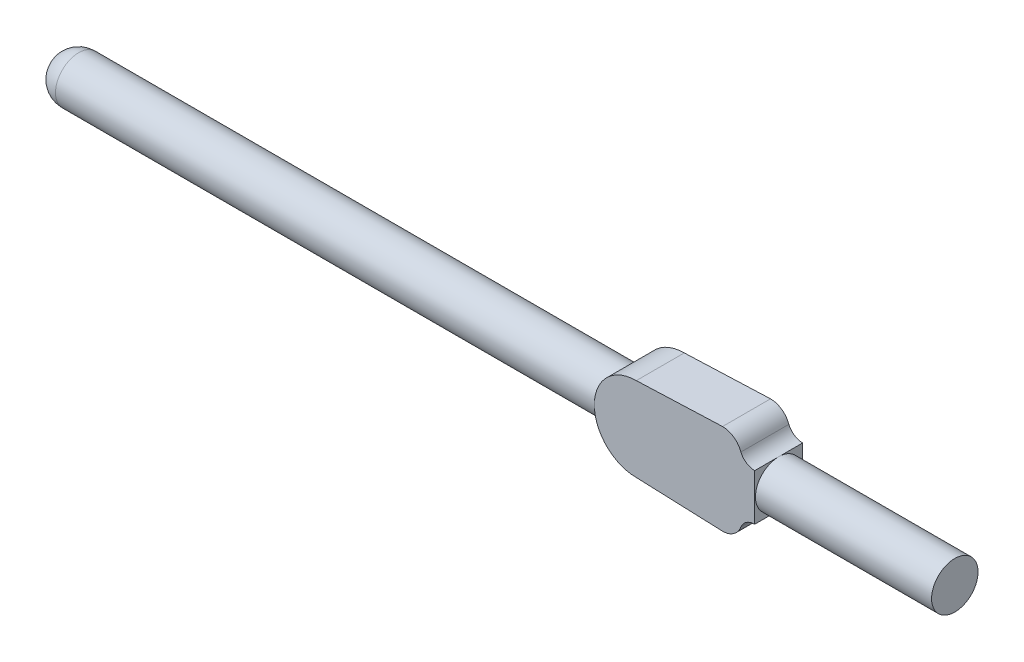
ISO-10303-21;
HEADER;
FILE_DESCRIPTION(('STEP AP214'),'2;1');
FILE_NAME('part.step','',(''),(''),'','','');
FILE_SCHEMA(('AUTOMOTIVE_DESIGN { 1 0 10303 214 1 1 1 1 }'));
ENDSEC;
DATA;
#1=APPLICATION_CONTEXT('core data for automotive mechanical design processes');
#2=APPLICATION_PROTOCOL_DEFINITION('international standard','automotive_design',2000,#1);
#3=PRODUCT_CONTEXT('',#1,'mechanical');
#4=PRODUCT('Part','Part','',(#3));
#5=PRODUCT_RELATED_PRODUCT_CATEGORY('part','',(#4));
#6=PRODUCT_DEFINITION_FORMATION('','',#4);
#7=PRODUCT_DEFINITION_CONTEXT('part definition',#1,'design');
#8=PRODUCT_DEFINITION('design','',#6,#7);
#9=PRODUCT_DEFINITION_SHAPE('','',#8);
#10=(LENGTH_UNIT() NAMED_UNIT(*) SI_UNIT(.MILLI.,.METRE.));
#11=(NAMED_UNIT(*) PLANE_ANGLE_UNIT() SI_UNIT($,.RADIAN.));
#12=(NAMED_UNIT(*) SI_UNIT($,.STERADIAN.) SOLID_ANGLE_UNIT());
#13=UNCERTAINTY_MEASURE_WITH_UNIT(LENGTH_MEASURE(1.E-05),#10,'distance_accuracy_value','');
#14=(GEOMETRIC_REPRESENTATION_CONTEXT(3) GLOBAL_UNCERTAINTY_ASSIGNED_CONTEXT((#13)) GLOBAL_UNIT_ASSIGNED_CONTEXT((#10,
#11,#12)) REPRESENTATION_CONTEXT('',''));
#15=CARTESIAN_POINT('',(0.,0.,0.));
#16=DIRECTION('',(0.,0.,1.));
#17=DIRECTION('',(1.,0.,0.));
#18=AXIS2_PLACEMENT_3D('',#15,#16,#17);
#19=CARTESIAN_POINT('',(-657.792003838961,0.,0.));
#20=DIRECTION('',(-1.,0.,0.));
#21=DIRECTION('',(0.,0.,1.));
#22=AXIS2_PLACEMENT_3D('',#19,#20,#21);
#23=CYLINDRICAL_SURFACE('',#22,15.5);
#24=CARTESIAN_POINT('',(75.5,0.,15.5));
#25=CARTESIAN_POINT('',(75.4999957170082,0.402180758867869,15.5000048225568));
#26=CARTESIAN_POINT('',(75.5086815513679,0.804306234661714,15.4843328775614));
#27=CARTESIAN_POINT('',(75.5431933217533,1.60552669665935,15.4218591432148));
#28=CARTESIAN_POINT('',(75.5690241290205,2.00462078898036,15.375048506709));
#29=CARTESIAN_POINT('',(75.6372120403772,2.79703704196102,15.2508242541293));
#30=CARTESIAN_POINT('',(75.6795882053421,3.19035200060479,15.1733753402422));
#31=CARTESIAN_POINT('',(75.7798023735612,3.96790931989795,14.988841005167));
#32=CARTESIAN_POINT('',(75.8376394531422,4.35215222104238,14.8817573544174));
#33=CARTESIAN_POINT('',(75.9671166818503,5.10750195067859,14.6396746156108));
#34=CARTESIAN_POINT('',(76.0386980485264,5.47865702644047,14.5047942364732));
#35=CARTESIAN_POINT('',(76.1941926694065,6.20739195886603,14.2082038499954));
#36=CARTESIAN_POINT('',(76.2781060651722,6.56497165963627,14.0464935346668));
#37=CARTESIAN_POINT('',(76.4564402425161,7.26472593620606,13.6976853936588));
#38=CARTESIAN_POINT('',(76.5508600139066,7.60690198863,13.5105900083741));
#39=CARTESIAN_POINT('',(76.7482672431839,8.27441617633484,13.1124025609869));
#40=CARTESIAN_POINT('',(76.8512554929653,8.59975275080222,12.901308280256));
#41=CARTESIAN_POINT('',(77.0711087119159,9.25424153854351,12.4410595324148));
#42=CARTESIAN_POINT('',(77.1884407314077,9.58209509913634,12.1902811338398));
#43=CARTESIAN_POINT('',(77.4279280275591,10.2157628154235,11.6643792493383));
#44=CARTESIAN_POINT('',(77.5500834826524,10.5215761545984,11.3892548623113));
#45=CARTESIAN_POINT('',(77.7966001313371,11.1102269745753,10.8158142328754));
#46=CARTESIAN_POINT('',(77.9209631531928,11.3930442144914,10.5174780020656));
#47=CARTESIAN_POINT('',(78.1689486220902,11.9342556068452,9.8991104261584));
#48=CARTESIAN_POINT('',(78.2925710268445,12.1926483769199,9.57907785486142));
#49=CARTESIAN_POINT('',(78.548319890717,12.7084465721715,8.88540619522641));
#50=CARTESIAN_POINT('',(78.6800558345796,12.9631540976181,8.50960981232674));
#51=CARTESIAN_POINT('',(78.9348791290312,13.4397879990485,7.73491691639888));
#52=CARTESIAN_POINT('',(79.057965717238,13.6617114872368,7.3360183727103));
#53=CARTESIAN_POINT('',(79.2910814514243,14.0706664956945,6.51732820918743));
#54=CARTESIAN_POINT('',(79.4011182655976,14.2577185441477,6.09754906695378));
#55=CARTESIAN_POINT('',(79.6038243203177,14.5949150238732,5.23936127985658));
#56=CARTESIAN_POINT('',(79.6964958722448,14.7450643678611,4.80095512386002));
#57=CARTESIAN_POINT('',(79.8551272973345,14.9980293960778,3.93684977648312));
#58=CARTESIAN_POINT('',(79.9224033973908,15.1032334347161,3.51209349229713));
#59=CARTESIAN_POINT('',(80.0350563496912,15.2776718608801,2.65236864382512));
#60=CARTESIAN_POINT('',(80.0804343618514,15.34690815359,2.21740062172298));
#61=CARTESIAN_POINT('',(80.1470492255853,15.4480867054725,1.34185378801541));
#62=CARTESIAN_POINT('',(80.1683165185187,15.4800759928091,0.901282763236244));
#63=CARTESIAN_POINT('',(80.1857180618452,15.506274390202,0.0185487223316812));
#64=CARTESIAN_POINT('',(80.1818558415531,15.5004888055504,-0.423614061521494));
#65=CARTESIAN_POINT('',(80.1517597040053,15.4551023349675,-1.23651129804321));
#66=CARTESIAN_POINT('',(80.1290858985086,15.4208813795826,-1.60769499187747));
#67=CARTESIAN_POINT('',(80.0667976169941,15.326064486763,-2.34519254768737));
#68=CARTESIAN_POINT('',(80.027185234593,15.2654718088703,-2.71150700573553));
#69=CARTESIAN_POINT('',(79.9323589861932,15.1186608932848,-3.43702777763611));
#70=CARTESIAN_POINT('',(79.877139025493,15.0324326443133,-3.79623125592747));
#71=CARTESIAN_POINT('',(79.7528665329132,14.8353363820206,-4.50535735061497));
#72=CARTESIAN_POINT('',(79.6838131265782,14.7244668109959,-4.85527937871734));
#73=CARTESIAN_POINT('',(79.5323158307525,14.476589275237,-5.551371523402));
#74=CARTESIAN_POINT('',(79.4496210915755,14.3390810886486,-5.89730835463888));
#75=CARTESIAN_POINT('',(79.2741623365346,14.0406108318856,-6.57638742989818));
#76=CARTESIAN_POINT('',(79.1813947791258,13.8796405057028,-6.90952511771747));
#77=CARTESIAN_POINT('',(78.9881005619583,13.5353520140867,-7.5617631854459));
#78=CARTESIAN_POINT('',(78.8875724847145,13.3520297624384,-7.88086098413173));
#79=CARTESIAN_POINT('',(78.6810450990416,12.9640951882615,-8.50393585861895));
#80=CARTESIAN_POINT('',(78.5750460048625,12.7594836991204,-8.80791352562437));
#81=CARTESIAN_POINT('',(78.3424879317597,12.2954174118236,-9.4473697414659));
#82=CARTESIAN_POINT('',(78.2153576904501,12.0324295276066,-9.78008328321822));
#83=CARTESIAN_POINT('',(77.9599480500761,11.4803426065587,-10.4226280835689));
#84=CARTESIAN_POINT('',(77.8316685792107,11.1912419278711,-10.7324579011106));
#85=CARTESIAN_POINT('',(77.5769790917439,10.5879308047207,-11.3280868608147));
#86=CARTESIAN_POINT('',(77.4505708309876,10.273698353913,-11.6138644825379));
#87=CARTESIAN_POINT('',(77.2027997722393,9.62178834062696,-12.1594316543837));
#88=CARTESIAN_POINT('',(77.0814350382861,9.28411990947754,-12.4192312310637));
#89=CARTESIAN_POINT('',(76.8384526297967,8.56251328264327,-12.9283238948149));
#90=CARTESIAN_POINT('',(76.7173982279452,8.17699018090886,-13.17564695792));
#91=CARTESIAN_POINT('',(76.4876624949451,7.38271766241136,-13.6365795782829));
#92=CARTESIAN_POINT('',(76.3789819745949,6.97396672627264,-13.8501869266732));
#93=CARTESIAN_POINT('',(76.177241057019,6.13614958021833,-14.2411791951522));
#94=CARTESIAN_POINT('',(76.084168885003,5.70709900031533,-14.4185914425625));
#95=CARTESIAN_POINT('',(75.9164162967918,4.8316091599666,-14.7350640801551));
#96=CARTESIAN_POINT('',(75.8417332272441,4.38517241893834,-14.8741300036526));
#97=CARTESIAN_POINT('',(75.7192028755294,3.52128226119562,-15.1006910796653));
#98=CARTESIAN_POINT('',(75.6694954334462,3.10503840138341,-15.1918001216912));
#99=CARTESIAN_POINT('',(75.5885468056094,2.26470507340846,-15.339591183339));
#100=CARTESIAN_POINT('',(75.5573045031996,1.8406160812702,-15.396275284772));
#101=CARTESIAN_POINT('',(75.5142021973108,0.988453977213012,-15.4743638837904));
#102=CARTESIAN_POINT('',(75.5023316182827,0.560383167540248,-15.4957876310138));
#103=CARTESIAN_POINT('',(75.4982918078097,-0.296142104011402,-15.5030861657073));
#104=CARTESIAN_POINT('',(75.5061212675333,-0.724596538512463,-15.4889633148225));
#105=CARTESIAN_POINT('',(75.5394923169973,-1.53558570910749,-15.4285620276297));
#106=CARTESIAN_POINT('',(75.5631955434869,-1.9184507240022,-15.385620156818));
#107=CARTESIAN_POINT('',(75.6258161566619,-2.67867718349399,-15.2716206682366));
#108=CARTESIAN_POINT('',(75.6647322869979,-3.05603907989441,-15.2005653721933));
#109=CARTESIAN_POINT('',(75.7568873664494,-3.80279741723752,-15.0311458252231));
#110=CARTESIAN_POINT('',(75.8101270252573,-4.17219346251396,-14.9327802211364));
#111=CARTESIAN_POINT('',(75.929750297878,-4.90077968524565,-14.7097763194443));
#112=CARTESIAN_POINT('',(75.996134487781,-5.25996941459588,-14.5851368703103));
#113=CARTESIAN_POINT('',(76.1422150025585,-5.97387967849602,-14.3077810002073));
#114=CARTESIAN_POINT('',(76.2221699462557,-6.32833215533411,-14.1545118159681));
#115=CARTESIAN_POINT('',(76.3926446410457,-7.02275797344038,-13.8231291205645));
#116=CARTESIAN_POINT('',(76.4831644199504,-7.36273127658874,-13.6450155439967));
#117=CARTESIAN_POINT('',(76.6729650398295,-8.02679780322142,-13.265250057119));
#118=CARTESIAN_POINT('',(76.7722478984335,-8.35088734274082,-13.0635927225779));
#119=CARTESIAN_POINT('',(76.9776325265659,-8.9818783123486,-12.638065487558));
#120=CARTESIAN_POINT('',(77.0837349176471,-9.28877817093357,-12.4141935613603));
#121=CARTESIAN_POINT('',(77.3129943277556,-9.91791806482991,-11.9190069445514));
#122=CARTESIAN_POINT('',(77.4367248718321,-10.2379819056877,-11.6451893130256));
#123=CARTESIAN_POINT('',(77.6872590685116,-10.854172033204,-11.0731082073));
#124=CARTESIAN_POINT('',(77.8140629246651,-11.1502967286718,-10.7748431107717));
#125=CARTESIAN_POINT('',(78.0678668650717,-11.7176480428391,-10.1549706029935));
#126=CARTESIAN_POINT('',(78.1948670182759,-11.9888492607876,-9.83333996342061));
#127=CARTESIAN_POINT('',(78.4457887890437,-12.5047509744983,-9.16833226601991));
#128=CARTESIAN_POINT('',(78.5697102818775,-12.7494503979032,-8.82495432910916));
#129=CARTESIAN_POINT('',(78.8208629527872,-13.2294874565817,-8.08941620250018));
#130=CARTESIAN_POINT('',(78.9475629836152,-13.4625017801981,-7.69555211308924));
#131=CARTESIAN_POINT('',(79.189186182932,-13.8940827653185,-6.88584980859829));
#132=CARTESIAN_POINT('',(79.304108411754,-14.0926466791447,-6.47000984422544));
#133=CARTESIAN_POINT('',(79.5175904946867,-14.4529537472337,-5.61918767590632));
#134=CARTESIAN_POINT('',(79.6161697492918,-14.614740644886,-5.18422895524608));
#135=CARTESIAN_POINT('',(79.7927822915569,-14.8995297028471,-4.29774583302005));
#136=CARTESIAN_POINT('',(79.8708194532574,-15.0225391770693,-3.84622457331563));
#137=CARTESIAN_POINT('',(79.996146580399,-15.2177856820504,-2.97468419503951));
#138=CARTESIAN_POINT('',(80.0456764142429,-15.2937758375796,-2.55582790364661));
#139=CARTESIAN_POINT('',(80.1226237479816,-15.4111405496108,-1.7112682595243));
#140=CARTESIAN_POINT('',(80.1500428981897,-15.4525176895929,-1.28556542023201));
#141=CARTESIAN_POINT('',(80.1814575327541,-15.499883638256,-0.431656793801518));
#142=CARTESIAN_POINT('',(80.1854710038764,-15.5058996212611,-0.00345318184835289));
#143=CARTESIAN_POINT('',(80.1699233422067,-15.4824976200279,0.85153125793618));
#144=CARTESIAN_POINT('',(80.1503642471658,-15.4530826986452,1.27831220555308));
#145=CARTESIAN_POINT('',(80.0929454296915,-15.3659374267715,2.06706036536228));
#146=CARTESIAN_POINT('',(80.0580226747785,-15.3127347349867,2.42975604517707));
#147=CARTESIAN_POINT('',(79.9726331033177,-15.1812106220351,3.14871117823466));
#148=CARTESIAN_POINT('',(79.9221657078261,-15.1028882653084,3.50497039123476));
#149=CARTESIAN_POINT('',(79.8072721399221,-14.9220006404138,4.20904582739966));
#150=CARTESIAN_POINT('',(79.7428424517078,-14.8194292655829,4.55685989944391));
#151=CARTESIAN_POINT('',(79.6019079755645,-14.5910652586913,5.24226311442478));
#152=CARTESIAN_POINT('',(79.5254022870778,-14.4652708946765,5.57985149254905));
#153=CARTESIAN_POINT('',(79.3574372571331,-14.1832711259438,6.26335359732373));
#154=CARTESIAN_POINT('',(79.2653552383264,-14.025691585639,6.60854661033904));
#155=CARTESIAN_POINT('',(79.0723449475664,-13.6867708960981,7.28459641868605));
#156=CARTESIAN_POINT('',(78.9714139264497,-13.5054223537055,7.61544871066763));
#157=CARTESIAN_POINT('',(78.7631492656166,-13.1200679918115,8.26168150489523));
#158=CARTESIAN_POINT('',(78.6558139884626,-12.9160563662317,8.57705801241061));
#159=CARTESIAN_POINT('',(78.4371342486518,-12.4864274560843,9.19127943542831));
#160=CARTESIAN_POINT('',(78.3257894685551,-12.2608084584622,9.49012303721693));
#161=CARTESIAN_POINT('',(78.0834297885984,-11.7511602017361,10.1167362455799));
#162=CARTESIAN_POINT('',(77.9521156674912,-11.4635590522258,10.4414937700415));
#163=CARTESIAN_POINT('',(77.6906171730351,-10.8620117112362,11.0659210000413));
#164=CARTESIAN_POINT('',(77.5604325266854,-10.5480720934028,11.3655969284518));
#165=CARTESIAN_POINT('',(77.304288598899,-9.89484102475481,11.9386366647154));
#166=CARTESIAN_POINT('',(77.1783333387457,-9.55552638416914,12.2119758688349));
#167=CARTESIAN_POINT('',(76.9339120354469,-8.85331417249868,12.7302491594152));
#168=CARTESIAN_POINT('',(76.815445787,-8.49041724844485,12.9751840246976));
#169=CARTESIAN_POINT('',(76.584759825945,-7.72877666925667,13.4433324940556));
#170=CARTESIAN_POINT('',(76.4729391447432,-7.3292001220975,13.6653918994683));
#171=CARTESIAN_POINT('',(76.2637341680346,-6.50884080975319,14.0746265425981));
#172=CARTESIAN_POINT('',(76.1663518181433,-6.08805519679075,14.2617970797908));
#173=CARTESIAN_POINT('',(75.9891439107871,-5.22920385526686,14.5985502636643));
#174=CARTESIAN_POINT('',(75.9092799325294,-4.79117847811924,14.7482152712813));
#175=CARTESIAN_POINT('',(75.7693851048935,-3.90076595557888,15.0082983355805));
#176=CARTESIAN_POINT('',(75.7093440136996,-3.44838635937679,15.1187366616068));
#177=CARTESIAN_POINT('',(75.6075084629641,-2.50040783272392,15.3051512122895));
#178=CARTESIAN_POINT('',(75.5673278095601,-2.00403318218391,15.3780946375925));
#179=CARTESIAN_POINT('',(75.5135765524797,-1.00507682782517,15.4755154745884));
#180=CARTESIAN_POINT('',(75.5000053512832,-0.502495263638853,15.4999939745702));
#181=CARTESIAN_POINT('',(75.5,0.,15.5));
#182=B_SPLINE_CURVE_WITH_KNOTS('',3,(#24,#25,#26,#27,#28,#29,#30,#31,#32,#33,#34,#35,#36,#37,
#38,#39,#40,#41,#42,#43,#44,#45,#46,#47,#48,#49,#50,#51,#52,#53,#54,#55,#56,#57,#58,#59,#60,#61,
#62,#63,#64,#65,#66,#67,#68,#69,#70,#71,#72,#73,#74,#75,#76,#77,#78,#79,#80,#81,#82,#83,#84,#85,
#86,#87,#88,#89,#90,#91,#92,#93,#94,#95,#96,#97,#98,#99,#100,#101,#102,#103,#104,#105,#106,#107,
#108,#109,#110,#111,#112,#113,#114,#115,#116,#117,#118,#119,#120,#121,#122,#123,#124,#125,#126,
#127,#128,#129,#130,#131,#132,#133,#134,#135,#136,#137,#138,#139,#140,#141,#142,#143,#144,#145,
#146,#147,#148,#149,#150,#151,#152,#153,#154,#155,#156,#157,#158,#159,#160,#161,#162,#163,#164,
#165,#166,#167,#168,#169,#170,#171,#172,#173,#174,#175,#176,#177,#178,#179,#180,#181),
.UNSPECIFIED.,.T.,.F.,(4,2,2,2,2,2,2,2,2,2,2,2,2,2,2,2,2,2,2,2,2,2,2,2,2,2,2,2,2,2,2,2,2,2,2,2,
2,2,2,2,2,2,2,2,2,2,2,2,2,2,2,2,2,2,2,2,2,2,2,2,2,2,2,2,2,2,2,2,2,2,2,2,2,2,2,2,2,2,4),(0.,
1.20605086912593,2.41244454901851,3.62023216027476,4.82794763145029,6.03060850625052,
7.23328318768777,8.43584233175129,9.63851273946156,10.9245471667492,12.2106292130239,
13.4978312677621,14.7851061312971,16.2014803942729,17.6179793448618,19.0336417767624,
20.4491156447368,21.7753012035158,23.1014165080882,24.4258556342063,25.7501087534693,
26.8691189958161,27.9879909678789,29.1073004603662,30.2266807302436,31.3695788804352,
32.5128801762639,33.6563907963147,34.799856669376,36.1266818435759,37.453590500814,
38.7816740458091,40.1092430052881,41.5286479664704,42.9481458806704,44.366568074367,
45.7847854846948,47.0699677360823,48.3550722597222,49.6394749749722,50.9237923593114,
52.0804206250847,53.236953391497,54.3935434715404,55.5501842530837,56.7320356628063,
57.9138901838364,59.0960175308805,60.2782527737667,61.5938797182754,62.9095940382934,
64.2266347329349,65.543728699848,66.9664151171791,68.3892149522828,69.8103135184638,
71.2311438868621,72.5149125291321,73.7985853436707,75.0812715528596,76.3638468870737,
77.467319155517,78.5708325265961,79.6746240935228,80.778498013719,81.9487727195655,
83.119412297607,84.2903524776745,85.4613855680419,86.8196055825928,88.1774876106544,
89.536626114855,90.8957273438833,92.3056324270412,93.7157273274981,95.1226980215313,
96.5289406396046,98.0358462912698,99.5427181047033),.UNSPECIFIED.);
#183=CARTESIAN_POINT('',(75.5,0.,15.5));
#184=VERTEX_POINT('',#183);
#185=EDGE_CURVE('E45',#184,#184,#182,.T.);
#186=ORIENTED_EDGE('',*,*,#185,.T.);
#187=EDGE_LOOP('',(#186));
#188=FACE_BOUND('',#187,.T.);
#189=CARTESIAN_POINT('',(-284.5,0.,0.));
#190=DIRECTION('',(-1.,0.,0.));
#191=DIRECTION('',(0.,0.,1.));
#192=AXIS2_PLACEMENT_3D('',#189,#190,#191);
#193=CIRCLE('',#192,15.5);
#194=CARTESIAN_POINT('',(-284.5,0.,15.5));
#195=VERTEX_POINT('',#194);
#196=EDGE_CURVE('E218',#195,#195,#193,.T.);
#197=ORIENTED_EDGE('',*,*,#196,.F.);
#198=EDGE_LOOP('',(#197));
#199=FACE_BOUND('',#198,.T.);
#200=ADVANCED_FACE('F41',(#188,#199),#23,.T.);
#201=CARTESIAN_POINT('',(-284.5,0.,0.));
#202=DIRECTION('',(-1.,0.,0.));
#203=DIRECTION('',(0.,1.,0.));
#204=AXIS2_PLACEMENT_3D('',#201,#202,#203);
#205=SPHERICAL_SURFACE('',#204,15.5);
#206=ORIENTED_EDGE('',*,*,#196,.T.);
#207=EDGE_LOOP('',(#206));
#208=FACE_BOUND('',#207,.T.);
#209=ADVANCED_FACE('F43',(#208),#205,.T.);
#210=CARTESIAN_POINT('',(103.5,0.,16.));
#211=DIRECTION('',(0.,0.,-1.));
#212=DIRECTION('',(-1.,0.,0.));
#213=AXIS2_PLACEMENT_3D('',#210,#211,#212);
#214=CYLINDRICAL_SURFACE('',#213,28.);
#215=CARTESIAN_POINT('',(103.5,0.,-16.));
#216=DIRECTION('',(0.,0.,1.));
#217=DIRECTION('',(1.,0.,0.));
#218=AXIS2_PLACEMENT_3D('',#215,#216,#217);
#219=CIRCLE('',#218,28.);
#220=CARTESIAN_POINT('',(103.5,-28.,-16.));
#221=VERTEX_POINT('',#220);
#222=CARTESIAN_POINT('',(103.5,28.,-16.));
#223=VERTEX_POINT('',#222);
#224=EDGE_CURVE('E170',#221,#223,#219,.F.);
#225=ORIENTED_EDGE('',*,*,#224,.F.);
#226=DIRECTION('',(0.,0.,-1.));
#227=VECTOR('',#226,1.);
#228=CARTESIAN_POINT('',(103.5,-28.,16.));
#229=LINE('',#228,#227);
#230=CARTESIAN_POINT('',(103.5,-28.,16.));
#231=VERTEX_POINT('',#230);
#232=EDGE_CURVE('E209',#231,#221,#229,.T.);
#233=ORIENTED_EDGE('',*,*,#232,.F.);
#234=CARTESIAN_POINT('',(103.5,0.,16.));
#235=DIRECTION('',(0.,0.,1.));
#236=DIRECTION('',(1.,0.,0.));
#237=AXIS2_PLACEMENT_3D('',#234,#235,#236);
#238=CIRCLE('',#237,28.);
#239=CARTESIAN_POINT('',(103.5,28.,16.));
#240=VERTEX_POINT('',#239);
#241=EDGE_CURVE('E144',#231,#240,#238,.F.);
#242=ORIENTED_EDGE('',*,*,#241,.T.);
#243=DIRECTION('',(0.,0.,-1.));
#244=VECTOR('',#243,1.);
#245=CARTESIAN_POINT('',(103.5,28.,16.));
#246=LINE('',#245,#244);
#247=EDGE_CURVE('E129',#240,#223,#246,.T.);
#248=ORIENTED_EDGE('',*,*,#247,.T.);
#249=EDGE_LOOP('',(#225,#233,#242,#248));
#250=FACE_BOUND('',#249,.T.);
#251=ORIENTED_EDGE('',*,*,#185,.F.);
#252=EDGE_LOOP('',(#251));
#253=FACE_BOUND('',#252,.T.);
#254=ADVANCED_FACE('F245',(#250,#253),#214,.T.);
#255=CARTESIAN_POINT('',(182.5,0.,16.));
#256=DIRECTION('',(1.,0.,0.));
#257=DIRECTION('',(0.,0.,-1.));
#258=AXIS2_PLACEMENT_3D('',#255,#256,#257);
#259=PLANE('',#258);
#260=CARTESIAN_POINT('',(182.5,0.,0.));
#261=DIRECTION('',(1.,0.,0.));
#262=DIRECTION('',(0.,0.,-1.));
#263=AXIS2_PLACEMENT_3D('',#260,#261,#262);
#264=CIRCLE('',#263,15.5);
#265=CARTESIAN_POINT('',(182.5,15.5,0.));
#266=VERTEX_POINT('',#265);
#267=CARTESIAN_POINT('',(182.5,-15.5,0.));
#268=VERTEX_POINT('',#267);
#269=EDGE_CURVE('E11',#266,#268,#264,.T.);
#270=ORIENTED_EDGE('',*,*,#269,.F.);
#271=DIRECTION('',(0.,0.,-1.));
#272=VECTOR('',#271,1.);
#273=CARTESIAN_POINT('',(182.5,15.5,16.));
#274=LINE('',#273,#272);
#275=CARTESIAN_POINT('',(182.5,15.5,16.));
#276=VERTEX_POINT('',#275);
#277=EDGE_CURVE('E62',#276,#266,#274,.T.);
#278=ORIENTED_EDGE('',*,*,#277,.F.);
#279=DIRECTION('',(0.,-1.,0.));
#280=VECTOR('',#279,1.);
#281=CARTESIAN_POINT('',(182.5,0.,16.));
#282=LINE('',#281,#280);
#283=CARTESIAN_POINT('',(182.5,-15.5,16.));
#284=VERTEX_POINT('',#283);
#285=EDGE_CURVE('E158',#276,#284,#282,.T.);
#286=ORIENTED_EDGE('',*,*,#285,.T.);
#287=DIRECTION('',(0.,0.,-1.));
#288=VECTOR('',#287,1.);
#289=CARTESIAN_POINT('',(182.5,-15.5,16.));
#290=LINE('',#289,#288);
#291=EDGE_CURVE('E197',#284,#268,#290,.T.);
#292=ORIENTED_EDGE('',*,*,#291,.T.);
#293=EDGE_LOOP('',(#270,#278,#286,#292));
#294=FACE_BOUND('',#293,.T.);
#295=ADVANCED_FACE('F227',(#294),#259,.T.);
#296=CARTESIAN_POINT('',(161.039643366314,17.25,16.));
#297=DIRECTION('',(0.,0.,-1.));
#298=DIRECTION('',(-1.,0.,0.));
#299=AXIS2_PLACEMENT_3D('',#296,#297,#298);
#300=CYLINDRICAL_SURFACE('',#299,13.);
#301=CARTESIAN_POINT('',(161.039643366314,17.25,-16.));
#302=DIRECTION('',(0.,0.,1.));
#303=DIRECTION('',(1.,0.,0.));
#304=AXIS2_PLACEMENT_3D('',#301,#302,#303);
#305=CIRCLE('',#304,13.);
#306=CARTESIAN_POINT('',(161.039643366314,30.25,-16.));
#307=VERTEX_POINT('',#306);
#308=CARTESIAN_POINT('',(173.281614907603,21.6242579693347,-16.));
#309=VERTEX_POINT('',#308);
#310=EDGE_CURVE('E123',#307,#309,#305,.F.);
#311=ORIENTED_EDGE('',*,*,#310,.F.);
#312=DIRECTION('',(0.,0.,-1.));
#313=VECTOR('',#312,1.);
#314=CARTESIAN_POINT('',(161.039643366314,30.25,16.));
#315=LINE('',#314,#313);
#316=CARTESIAN_POINT('',(161.039643366314,30.25,16.));
#317=VERTEX_POINT('',#316);
#318=EDGE_CURVE('E117',#317,#307,#315,.T.);
#319=ORIENTED_EDGE('',*,*,#318,.F.);
#320=CARTESIAN_POINT('',(161.039643366314,17.25,16.));
#321=DIRECTION('',(0.,0.,1.));
#322=DIRECTION('',(1.,0.,0.));
#323=AXIS2_PLACEMENT_3D('',#320,#321,#322);
#324=CIRCLE('',#323,13.);
#325=CARTESIAN_POINT('',(173.281614907603,21.6242579693347,16.));
#326=VERTEX_POINT('',#325);
#327=EDGE_CURVE('E120',#317,#326,#324,.F.);
#328=ORIENTED_EDGE('',*,*,#327,.T.);
#329=DIRECTION('',(0.,0.,-1.));
#330=VECTOR('',#329,1.);
#331=CARTESIAN_POINT('',(173.281614907603,21.6242579693347,16.));
#332=LINE('',#331,#330);
#333=EDGE_CURVE('E164',#326,#309,#332,.T.);
#334=ORIENTED_EDGE('',*,*,#333,.T.);
#335=EDGE_LOOP('',(#311,#319,#328,#334));
#336=FACE_BOUND('',#335,.T.);
#337=ADVANCED_FACE('F119',(#336),#300,.T.);
#338=CARTESIAN_POINT('',(-0.935207327650957,23.9162204918221,16.));
#339=DIRECTION('',(-0.0390736129345283,0.999236334793848,0.));
#340=DIRECTION('',(-0.999236334793848,-0.0390736129345283,0.));
#341=AXIS2_PLACEMENT_3D('',#338,#339,#340);
#342=PLANE('',#341);
#343=DIRECTION('',(0.999236334793848,0.0390736129345283,0.));
#344=VECTOR('',#343,1.);
#345=CARTESIAN_POINT('',(-0.935207327650957,23.9162204918221,-16.));
#346=LINE('',#345,#344);
#347=EDGE_CURVE('E167',#223,#307,#346,.T.);
#348=ORIENTED_EDGE('',*,*,#347,.F.);
#349=ORIENTED_EDGE('',*,*,#247,.F.);
#350=DIRECTION('',(0.999236334793848,0.0390736129345283,0.));
#351=VECTOR('',#350,1.);
#352=CARTESIAN_POINT('',(-0.935207327650957,23.9162204918221,16.));
#353=LINE('',#352,#351);
#354=EDGE_CURVE('E135',#240,#317,#353,.T.);
#355=ORIENTED_EDGE('',*,*,#354,.T.);
#356=ORIENTED_EDGE('',*,*,#318,.T.);
#357=EDGE_LOOP('',(#348,#349,#355,#356));
#358=FACE_BOUND('',#357,.T.);
#359=ADVANCED_FACE('F142',(#358),#342,.T.);
#360=CARTESIAN_POINT('',(-0.935207327650953,-23.9162204918222,16.));
#361=DIRECTION('',(0.039073612934528,0.999236334793848,0.));
#362=DIRECTION('',(-0.999236334793848,0.039073612934528,0.));
#363=AXIS2_PLACEMENT_3D('',#360,#361,#362);
#364=PLANE('',#363);
#365=DIRECTION('',(0.999236334793848,-0.039073612934528,0.));
#366=VECTOR('',#365,1.);
#367=CARTESIAN_POINT('',(-0.935207327650953,-23.9162204918222,-16.));
#368=LINE('',#367,#366);
#369=CARTESIAN_POINT('',(161.039643366314,-30.25,-16.));
#370=VERTEX_POINT('',#369);
#371=EDGE_CURVE('E174',#221,#370,#368,.T.);
#372=ORIENTED_EDGE('',*,*,#371,.T.);
#373=DIRECTION('',(0.,0.,-1.));
#374=VECTOR('',#373,1.);
#375=CARTESIAN_POINT('',(161.039643366314,-30.25,16.));
#376=LINE('',#375,#374);
#377=CARTESIAN_POINT('',(161.039643366314,-30.25,16.));
#378=VERTEX_POINT('',#377);
#379=EDGE_CURVE('E205',#378,#370,#376,.T.);
#380=ORIENTED_EDGE('',*,*,#379,.F.);
#381=DIRECTION('',(0.999236334793848,-0.039073612934528,0.));
#382=VECTOR('',#381,1.);
#383=CARTESIAN_POINT('',(-0.935207327650953,-23.9162204918222,16.));
#384=LINE('',#383,#382);
#385=EDGE_CURVE('E147',#231,#378,#384,.T.);
#386=ORIENTED_EDGE('',*,*,#385,.F.);
#387=ORIENTED_EDGE('',*,*,#232,.T.);
#388=EDGE_LOOP('',(#372,#380,#386,#387));
#389=FACE_BOUND('',#388,.T.);
#390=ADVANCED_FACE('F252',(#389),#364,.F.);
#391=CARTESIAN_POINT('',(161.039643366314,-17.25,16.));
#392=DIRECTION('',(0.,0.,-1.));
#393=DIRECTION('',(-1.,0.,0.));
#394=AXIS2_PLACEMENT_3D('',#391,#392,#393);
#395=CYLINDRICAL_SURFACE('',#394,13.);
#396=CARTESIAN_POINT('',(161.039643366314,-17.25,-16.));
#397=DIRECTION('',(0.,0.,1.));
#398=DIRECTION('',(1.,0.,0.));
#399=AXIS2_PLACEMENT_3D('',#396,#397,#398);
#400=CIRCLE('',#399,13.);
#401=CARTESIAN_POINT('',(173.281614907603,-21.6242579693347,-16.));
#402=VERTEX_POINT('',#401);
#403=EDGE_CURVE('E177',#370,#402,#400,.T.);
#404=ORIENTED_EDGE('',*,*,#403,.T.);
#405=DIRECTION('',(0.,0.,-1.));
#406=VECTOR('',#405,1.);
#407=CARTESIAN_POINT('',(173.281614907603,-21.6242579693347,16.));
#408=LINE('',#407,#406);
#409=CARTESIAN_POINT('',(173.281614907603,-21.6242579693347,16.));
#410=VERTEX_POINT('',#409);
#411=EDGE_CURVE('E201',#410,#402,#408,.T.);
#412=ORIENTED_EDGE('',*,*,#411,.F.);
#413=CARTESIAN_POINT('',(161.039643366314,-17.25,16.));
#414=DIRECTION('',(0.,0.,1.));
#415=DIRECTION('',(1.,0.,0.));
#416=AXIS2_PLACEMENT_3D('',#413,#414,#415);
#417=CIRCLE('',#416,13.);
#418=EDGE_CURVE('E152',#378,#410,#417,.T.);
#419=ORIENTED_EDGE('',*,*,#418,.F.);
#420=ORIENTED_EDGE('',*,*,#379,.T.);
#421=EDGE_LOOP('',(#404,#412,#419,#420));
#422=FACE_BOUND('',#421,.T.);
#423=ADVANCED_FACE('F254',(#422),#395,.T.);
#424=CARTESIAN_POINT('',(182.5,-25.5,16.));
#425=DIRECTION('',(0.,0.,-1.));
#426=DIRECTION('',(-1.,0.,0.));
#427=AXIS2_PLACEMENT_3D('',#424,#425,#426);
#428=CYLINDRICAL_SURFACE('',#427,10.);
#429=CARTESIAN_POINT('',(182.5,-25.5,-16.));
#430=DIRECTION('',(0.,0.,1.));
#431=DIRECTION('',(1.,0.,0.));
#432=AXIS2_PLACEMENT_3D('',#429,#430,#431);
#433=CIRCLE('',#432,10.);
#434=CARTESIAN_POINT('',(182.5,-15.5,-16.));
#435=VERTEX_POINT('',#434);
#436=EDGE_CURVE('E180',#402,#435,#433,.F.);
#437=ORIENTED_EDGE('',*,*,#436,.T.);
#438=EDGE_CURVE('E196',#268,#435,#290,.T.);
#439=ORIENTED_EDGE('',*,*,#438,.F.);
#440=ORIENTED_EDGE('',*,*,#291,.F.);
#441=CARTESIAN_POINT('',(182.5,-25.5,16.));
#442=DIRECTION('',(0.,0.,1.));
#443=DIRECTION('',(1.,0.,0.));
#444=AXIS2_PLACEMENT_3D('',#441,#442,#443);
#445=CIRCLE('',#444,10.);
#446=EDGE_CURVE('E155',#410,#284,#445,.F.);
#447=ORIENTED_EDGE('',*,*,#446,.F.);
#448=ORIENTED_EDGE('',*,*,#411,.T.);
#449=EDGE_LOOP('',(#437,#439,#440,#447,#448));
#450=FACE_BOUND('',#449,.T.);
#451=ADVANCED_FACE('F231',(#450),#428,.F.);
#452=EDGE_CURVE('E55',#268,#266,#264,.T.);
#453=ORIENTED_EDGE('',*,*,#452,.F.);
#454=ORIENTED_EDGE('',*,*,#438,.T.);
#455=DIRECTION('',(0.,-1.,0.));
#456=VECTOR('',#455,1.);
#457=CARTESIAN_POINT('',(182.5,0.,-16.));
#458=LINE('',#457,#456);
#459=CARTESIAN_POINT('',(182.5,15.5,-16.));
#460=VERTEX_POINT('',#459);
#461=EDGE_CURVE('E184',#460,#435,#458,.T.);
#462=ORIENTED_EDGE('',*,*,#461,.F.);
#463=EDGE_CURVE('E193',#266,#460,#274,.T.);
#464=ORIENTED_EDGE('',*,*,#463,.F.);
#465=EDGE_LOOP('',(#453,#454,#462,#464));
#466=FACE_BOUND('',#465,.T.);
#467=ADVANCED_FACE('F238',(#466),#259,.T.);
#468=CARTESIAN_POINT('',(182.5,25.5,16.));
#469=DIRECTION('',(0.,0.,-1.));
#470=DIRECTION('',(-1.,0.,0.));
#471=AXIS2_PLACEMENT_3D('',#468,#469,#470);
#472=CYLINDRICAL_SURFACE('',#471,10.);
#473=CARTESIAN_POINT('',(182.5,25.5,-16.));
#474=DIRECTION('',(0.,0.,1.));
#475=DIRECTION('',(1.,0.,0.));
#476=AXIS2_PLACEMENT_3D('',#473,#474,#475);
#477=CIRCLE('',#476,10.);
#478=EDGE_CURVE('E140',#309,#460,#477,.T.);
#479=ORIENTED_EDGE('',*,*,#478,.F.);
#480=ORIENTED_EDGE('',*,*,#333,.F.);
#481=CARTESIAN_POINT('',(182.5,25.5,16.));
#482=DIRECTION('',(0.,0.,1.));
#483=DIRECTION('',(1.,0.,0.));
#484=AXIS2_PLACEMENT_3D('',#481,#482,#483);
#485=CIRCLE('',#484,10.);
#486=EDGE_CURVE('E138',#326,#276,#485,.T.);
#487=ORIENTED_EDGE('',*,*,#486,.T.);
#488=ORIENTED_EDGE('',*,*,#277,.T.);
#489=ORIENTED_EDGE('',*,*,#463,.T.);
#490=EDGE_LOOP('',(#479,#480,#487,#488,#489));
#491=FACE_BOUND('',#490,.T.);
#492=ADVANCED_FACE('F237',(#491),#472,.F.);
#493=CARTESIAN_POINT('',(0.,0.,16.));
#494=DIRECTION('',(0.,0.,1.));
#495=DIRECTION('',(1.,0.,0.));
#496=AXIS2_PLACEMENT_3D('',#493,#494,#495);
#497=PLANE('',#496);
#498=ORIENTED_EDGE('',*,*,#327,.F.);
#499=ORIENTED_EDGE('',*,*,#354,.F.);
#500=ORIENTED_EDGE('',*,*,#241,.F.);
#501=ORIENTED_EDGE('',*,*,#385,.T.);
#502=ORIENTED_EDGE('',*,*,#418,.T.);
#503=ORIENTED_EDGE('',*,*,#446,.T.);
#504=ORIENTED_EDGE('',*,*,#285,.F.);
#505=ORIENTED_EDGE('',*,*,#486,.F.);
#506=EDGE_LOOP('',(#498,#499,#500,#501,#502,#503,#504,#505));
#507=FACE_BOUND('',#506,.T.);
#508=ADVANCED_FACE('F133',(#507),#497,.T.);
#509=CARTESIAN_POINT('',(0.,0.,-16.));
#510=DIRECTION('',(0.,0.,1.));
#511=DIRECTION('',(1.,0.,0.));
#512=AXIS2_PLACEMENT_3D('',#509,#510,#511);
#513=PLANE('',#512);
#514=ORIENTED_EDGE('',*,*,#310,.T.);
#515=ORIENTED_EDGE('',*,*,#478,.T.);
#516=ORIENTED_EDGE('',*,*,#461,.T.);
#517=ORIENTED_EDGE('',*,*,#436,.F.);
#518=ORIENTED_EDGE('',*,*,#403,.F.);
#519=ORIENTED_EDGE('',*,*,#371,.F.);
#520=ORIENTED_EDGE('',*,*,#224,.T.);
#521=ORIENTED_EDGE('',*,*,#347,.T.);
#522=EDGE_LOOP('',(#514,#515,#516,#517,#518,#519,#520,#521));
#523=FACE_BOUND('',#522,.T.);
#524=ADVANCED_FACE('F240',(#523),#513,.F.);
#525=CARTESIAN_POINT('',(300.,0.,0.));
#526=DIRECTION('',(-1.,0.,0.));
#527=DIRECTION('',(0.,0.,1.));
#528=AXIS2_PLACEMENT_3D('',#525,#526,#527);
#529=PLANE('',#528);
#530=CARTESIAN_POINT('',(300.,0.,0.));
#531=DIRECTION('',(-1.,0.,0.));
#532=DIRECTION('',(0.,0.,1.));
#533=AXIS2_PLACEMENT_3D('',#530,#531,#532);
#534=CIRCLE('',#533,15.5000000000001);
#535=CARTESIAN_POINT('',(300.,0.,15.5000000000001));
#536=VERTEX_POINT('',#535);
#537=EDGE_CURVE('E214',#536,#536,#534,.T.);
#538=ORIENTED_EDGE('',*,*,#537,.F.);
#539=EDGE_LOOP('',(#538));
#540=FACE_BOUND('',#539,.T.);
#541=ADVANCED_FACE('F274',(#540),#529,.F.);
#542=ORIENTED_EDGE('',*,*,#452,.T.);
#543=ORIENTED_EDGE('',*,*,#269,.T.);
#544=EDGE_LOOP('',(#542,#543));
#545=FACE_BOUND('',#544,.T.);
#546=ORIENTED_EDGE('',*,*,#537,.T.);
#547=EDGE_LOOP('',(#546));
#548=FACE_BOUND('',#547,.T.);
#549=ADVANCED_FACE('F223',(#545,#548),#23,.T.);
#550=CLOSED_SHELL('',(#200,#209,#254,#295,#337,#359,#390,#423,#451,#467,#492,#508,#524,#541,#549));
#551=MANIFOLD_SOLID_BREP('B2',#550);
#552=ADVANCED_BREP_SHAPE_REPRESENTATION('',(#18,#551),#14);
#553=SHAPE_DEFINITION_REPRESENTATION(#9,#552);
ENDSEC;
END-ISO-10303-21;
